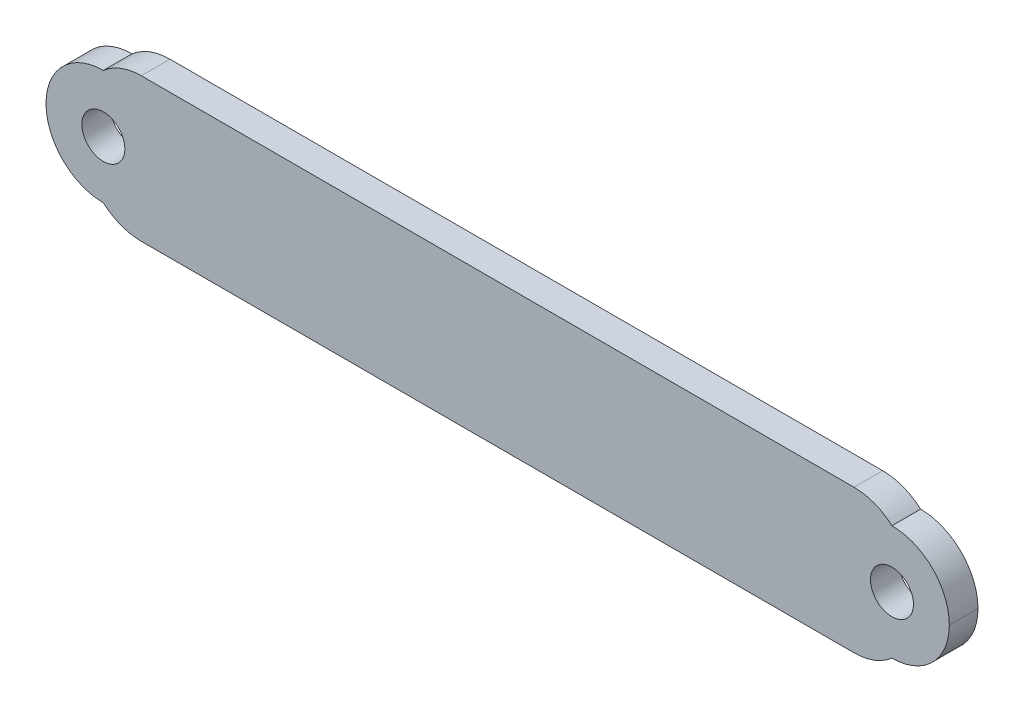
ISO-10303-21;
HEADER;
FILE_DESCRIPTION(('STEP AP214'),'2;1');
FILE_NAME('part.step','',(''),(''),'','','');
FILE_SCHEMA(('AUTOMOTIVE_DESIGN { 1 0 10303 214 1 1 1 1 }'));
ENDSEC;
DATA;
#1=APPLICATION_CONTEXT('core data for automotive mechanical design processes');
#2=APPLICATION_PROTOCOL_DEFINITION('international standard','automotive_design',2000,#1);
#3=PRODUCT_CONTEXT('',#1,'mechanical');
#4=PRODUCT('Part','Part','',(#3));
#5=PRODUCT_RELATED_PRODUCT_CATEGORY('part','',(#4));
#6=PRODUCT_DEFINITION_FORMATION('','',#4);
#7=PRODUCT_DEFINITION_CONTEXT('part definition',#1,'design');
#8=PRODUCT_DEFINITION('design','',#6,#7);
#9=PRODUCT_DEFINITION_SHAPE('','',#8);
#10=(LENGTH_UNIT() NAMED_UNIT(*) SI_UNIT(.MILLI.,.METRE.));
#11=(NAMED_UNIT(*) PLANE_ANGLE_UNIT() SI_UNIT($,.RADIAN.));
#12=(NAMED_UNIT(*) SI_UNIT($,.STERADIAN.) SOLID_ANGLE_UNIT());
#13=UNCERTAINTY_MEASURE_WITH_UNIT(LENGTH_MEASURE(1.E-05),#10,'distance_accuracy_value','');
#14=(GEOMETRIC_REPRESENTATION_CONTEXT(3) GLOBAL_UNCERTAINTY_ASSIGNED_CONTEXT((#13)) GLOBAL_UNIT_ASSIGNED_CONTEXT((#10,
#11,#12)) REPRESENTATION_CONTEXT('',''));
#15=CARTESIAN_POINT('',(0.,0.,0.));
#16=DIRECTION('',(0.,0.,1.));
#17=DIRECTION('',(1.,0.,0.));
#18=AXIS2_PLACEMENT_3D('',#15,#16,#17);
#19=CARTESIAN_POINT('',(0.,0.,2.54));
#20=DIRECTION('',(0.,0.,-1.));
#21=DIRECTION('',(-1.,0.,0.));
#22=AXIS2_PLACEMENT_3D('',#19,#20,#21);
#23=PLANE('',#22);
#24=CARTESIAN_POINT('',(5.08,5.08,2.54));
#25=DIRECTION('',(0.,0.,-1.));
#26=DIRECTION('',(-1.,0.,0.));
#27=AXIS2_PLACEMENT_3D('',#24,#25,#26);
#28=CIRCLE('',#27,5.08);
#29=CARTESIAN_POINT('',(0.,5.08,2.54));
#30=VERTEX_POINT('',#29);
#31=CARTESIAN_POINT('',(5.08,0.,2.54));
#32=VERTEX_POINT('',#31);
#33=EDGE_CURVE('E179',#30,#32,#28,.F.);
#34=ORIENTED_EDGE('',*,*,#33,.T.);
#35=CARTESIAN_POINT('',(8.44010416505203,3.81,2.54));
#36=DIRECTION('',(0.,0.,-1.));
#37=DIRECTION('',(-1.,0.,0.));
#38=AXIS2_PLACEMENT_3D('',#35,#36,#37);
#39=CIRCLE('',#38,5.08);
#40=CARTESIAN_POINT('',(8.44010416505203,-1.27,2.54));
#41=VERTEX_POINT('',#40);
#42=EDGE_CURVE('E46',#32,#41,#39,.F.);
#43=ORIENTED_EDGE('',*,*,#42,.T.);
#44=DIRECTION('',(1.,0.,0.));
#45=VECTOR('',#44,1.);
#46=CARTESIAN_POINT('',(6.34999999999999,-1.27,2.54));
#47=LINE('',#46,#45);
#48=CARTESIAN_POINT('',(71.569895834948,-1.27,2.54));
#49=VERTEX_POINT('',#48);
#50=EDGE_CURVE('E133',#41,#49,#47,.T.);
#51=ORIENTED_EDGE('',*,*,#50,.T.);
#52=CARTESIAN_POINT('',(71.569895834948,3.81,2.54));
#53=DIRECTION('',(0.,0.,1.));
#54=DIRECTION('',(1.,0.,0.));
#55=AXIS2_PLACEMENT_3D('',#52,#53,#54);
#56=CIRCLE('',#55,5.08);
#57=CARTESIAN_POINT('',(74.93,0.,2.54));
#58=VERTEX_POINT('',#57);
#59=EDGE_CURVE('E119',#58,#49,#56,.F.);
#60=ORIENTED_EDGE('',*,*,#59,.F.);
#61=CARTESIAN_POINT('',(74.93,5.08,2.54));
#62=DIRECTION('',(0.,0.,1.));
#63=DIRECTION('',(1.,0.,0.));
#64=AXIS2_PLACEMENT_3D('',#61,#62,#63);
#65=CIRCLE('',#64,5.08);
#66=CARTESIAN_POINT('',(80.01,5.08,2.54));
#67=VERTEX_POINT('',#66);
#68=EDGE_CURVE('E131',#67,#58,#65,.F.);
#69=ORIENTED_EDGE('',*,*,#68,.F.);
#70=CARTESIAN_POINT('',(74.93,5.08,2.54));
#71=DIRECTION('',(0.,0.,1.));
#72=DIRECTION('',(1.,0.,0.));
#73=AXIS2_PLACEMENT_3D('',#70,#71,#72);
#74=CIRCLE('',#73,5.08);
#75=CARTESIAN_POINT('',(74.93,10.16,2.54));
#76=VERTEX_POINT('',#75);
#77=EDGE_CURVE('E140',#76,#67,#74,.F.);
#78=ORIENTED_EDGE('',*,*,#77,.F.);
#79=CARTESIAN_POINT('',(71.569895834948,6.35,2.54));
#80=DIRECTION('',(0.,0.,1.));
#81=DIRECTION('',(1.,0.,0.));
#82=AXIS2_PLACEMENT_3D('',#79,#80,#81);
#83=CIRCLE('',#82,5.08);
#84=CARTESIAN_POINT('',(71.569895834948,11.43,2.54));
#85=VERTEX_POINT('',#84);
#86=EDGE_CURVE('E136',#85,#76,#83,.F.);
#87=ORIENTED_EDGE('',*,*,#86,.F.);
#88=DIRECTION('',(-1.,0.,0.));
#89=VECTOR('',#88,1.);
#90=CARTESIAN_POINT('',(6.35,11.43,2.54));
#91=LINE('',#90,#89);
#92=CARTESIAN_POINT('',(8.44010416505203,11.43,2.54));
#93=VERTEX_POINT('',#92);
#94=EDGE_CURVE('E162',#85,#93,#91,.T.);
#95=ORIENTED_EDGE('',*,*,#94,.T.);
#96=CARTESIAN_POINT('',(8.44010416505203,6.35,2.54));
#97=DIRECTION('',(0.,0.,-1.));
#98=DIRECTION('',(-1.,0.,0.));
#99=AXIS2_PLACEMENT_3D('',#96,#97,#98);
#100=CIRCLE('',#99,5.08);
#101=CARTESIAN_POINT('',(5.08,10.16,2.54));
#102=VERTEX_POINT('',#101);
#103=EDGE_CURVE('E181',#93,#102,#100,.F.);
#104=ORIENTED_EDGE('',*,*,#103,.T.);
#105=CARTESIAN_POINT('',(5.08,5.08,2.54));
#106=DIRECTION('',(0.,0.,-1.));
#107=DIRECTION('',(-1.,0.,0.));
#108=AXIS2_PLACEMENT_3D('',#105,#106,#107);
#109=CIRCLE('',#108,5.08);
#110=EDGE_CURVE('E60',#102,#30,#109,.F.);
#111=ORIENTED_EDGE('',*,*,#110,.T.);
#112=EDGE_LOOP('',(#34,#43,#51,#60,#69,#78,#87,#95,#104,#111));
#113=FACE_BOUND('',#112,.T.);
#114=CARTESIAN_POINT('',(5.08,5.08,2.54));
#115=DIRECTION('',(0.,0.,1.));
#116=DIRECTION('',(1.,0.,0.));
#117=AXIS2_PLACEMENT_3D('',#114,#115,#116);
#118=CIRCLE('',#117,1.905);
#119=CARTESIAN_POINT('',(6.985,5.08,2.54));
#120=VERTEX_POINT('',#119);
#121=EDGE_CURVE('E154',#120,#120,#118,.T.);
#122=ORIENTED_EDGE('',*,*,#121,.F.);
#123=EDGE_LOOP('',(#122));
#124=FACE_BOUND('',#123,.T.);
#125=CARTESIAN_POINT('',(74.93,5.08,2.54));
#126=DIRECTION('',(0.,0.,-1.));
#127=DIRECTION('',(-1.,0.,0.));
#128=AXIS2_PLACEMENT_3D('',#125,#126,#127);
#129=CIRCLE('',#128,1.905);
#130=CARTESIAN_POINT('',(73.025,5.08,2.54));
#131=VERTEX_POINT('',#130);
#132=EDGE_CURVE('E220',#131,#131,#129,.T.);
#133=ORIENTED_EDGE('',*,*,#132,.T.);
#134=EDGE_LOOP('',(#133));
#135=FACE_BOUND('',#134,.T.);
#136=ADVANCED_FACE('F37',(#113,#124,#135),#23,.F.);
#137=CARTESIAN_POINT('',(0.,0.,0.));
#138=DIRECTION('',(0.,0.,-1.));
#139=DIRECTION('',(-1.,0.,0.));
#140=AXIS2_PLACEMENT_3D('',#137,#138,#139);
#141=PLANE('',#140);
#142=DIRECTION('',(1.,0.,0.));
#143=VECTOR('',#142,1.);
#144=CARTESIAN_POINT('',(6.34999999999999,-1.27,0.));
#145=LINE('',#144,#143);
#146=CARTESIAN_POINT('',(8.44010416505203,-1.27,0.));
#147=VERTEX_POINT('',#146);
#148=CARTESIAN_POINT('',(71.569895834948,-1.27,0.));
#149=VERTEX_POINT('',#148);
#150=EDGE_CURVE('E157',#147,#149,#145,.T.);
#151=ORIENTED_EDGE('',*,*,#150,.F.);
#152=CARTESIAN_POINT('',(8.44010416505203,3.81,0.));
#153=DIRECTION('',(0.,0.,-1.));
#154=DIRECTION('',(-1.,0.,0.));
#155=AXIS2_PLACEMENT_3D('',#152,#153,#154);
#156=CIRCLE('',#155,5.08);
#157=CARTESIAN_POINT('',(5.08,0.,0.));
#158=VERTEX_POINT('',#157);
#159=EDGE_CURVE('E176',#147,#158,#156,.T.);
#160=ORIENTED_EDGE('',*,*,#159,.T.);
#161=CARTESIAN_POINT('',(5.08,5.08,0.));
#162=DIRECTION('',(0.,0.,-1.));
#163=DIRECTION('',(-1.,0.,0.));
#164=AXIS2_PLACEMENT_3D('',#161,#162,#163);
#165=CIRCLE('',#164,5.08);
#166=CARTESIAN_POINT('',(0.,5.08,0.));
#167=VERTEX_POINT('',#166);
#168=EDGE_CURVE('E172',#158,#167,#165,.T.);
#169=ORIENTED_EDGE('',*,*,#168,.T.);
#170=CARTESIAN_POINT('',(5.08,5.08,0.));
#171=DIRECTION('',(0.,0.,-1.));
#172=DIRECTION('',(-1.,0.,0.));
#173=AXIS2_PLACEMENT_3D('',#170,#171,#172);
#174=CIRCLE('',#173,5.08);
#175=CARTESIAN_POINT('',(5.08,10.16,0.));
#176=VERTEX_POINT('',#175);
#177=EDGE_CURVE('E170',#167,#176,#174,.T.);
#178=ORIENTED_EDGE('',*,*,#177,.T.);
#179=CARTESIAN_POINT('',(8.44010416505203,6.35,0.));
#180=DIRECTION('',(0.,0.,-1.));
#181=DIRECTION('',(-1.,0.,0.));
#182=AXIS2_PLACEMENT_3D('',#179,#180,#181);
#183=CIRCLE('',#182,5.08);
#184=CARTESIAN_POINT('',(8.44010416505203,11.43,0.));
#185=VERTEX_POINT('',#184);
#186=EDGE_CURVE('E174',#176,#185,#183,.T.);
#187=ORIENTED_EDGE('',*,*,#186,.T.);
#188=DIRECTION('',(-1.,0.,0.));
#189=VECTOR('',#188,1.);
#190=CARTESIAN_POINT('',(6.35,11.43,0.));
#191=LINE('',#190,#189);
#192=CARTESIAN_POINT('',(71.569895834948,11.43,0.));
#193=VERTEX_POINT('',#192);
#194=EDGE_CURVE('E163',#193,#185,#191,.T.);
#195=ORIENTED_EDGE('',*,*,#194,.F.);
#196=CARTESIAN_POINT('',(71.569895834948,6.35,0.));
#197=DIRECTION('',(0.,0.,1.));
#198=DIRECTION('',(1.,0.,0.));
#199=AXIS2_PLACEMENT_3D('',#196,#197,#198);
#200=CIRCLE('',#199,5.08);
#201=CARTESIAN_POINT('',(74.93,10.16,0.));
#202=VERTEX_POINT('',#201);
#203=EDGE_CURVE('E208',#202,#193,#200,.T.);
#204=ORIENTED_EDGE('',*,*,#203,.F.);
#205=CARTESIAN_POINT('',(74.93,5.08,0.));
#206=DIRECTION('',(0.,0.,1.));
#207=DIRECTION('',(1.,0.,0.));
#208=AXIS2_PLACEMENT_3D('',#205,#206,#207);
#209=CIRCLE('',#208,5.08);
#210=CARTESIAN_POINT('',(80.01,5.08,0.));
#211=VERTEX_POINT('',#210);
#212=EDGE_CURVE('E214',#211,#202,#209,.T.);
#213=ORIENTED_EDGE('',*,*,#212,.F.);
#214=CARTESIAN_POINT('',(74.93,5.08,0.));
#215=DIRECTION('',(0.,0.,1.));
#216=DIRECTION('',(1.,0.,0.));
#217=AXIS2_PLACEMENT_3D('',#214,#215,#216);
#218=CIRCLE('',#217,5.08);
#219=CARTESIAN_POINT('',(74.93,0.,0.));
#220=VERTEX_POINT('',#219);
#221=EDGE_CURVE('E212',#220,#211,#218,.T.);
#222=ORIENTED_EDGE('',*,*,#221,.F.);
#223=CARTESIAN_POINT('',(71.569895834948,3.81,0.));
#224=DIRECTION('',(0.,0.,1.));
#225=DIRECTION('',(1.,0.,0.));
#226=AXIS2_PLACEMENT_3D('',#223,#224,#225);
#227=CIRCLE('',#226,5.08);
#228=EDGE_CURVE('E121',#149,#220,#227,.T.);
#229=ORIENTED_EDGE('',*,*,#228,.F.);
#230=EDGE_LOOP('',(#151,#160,#169,#178,#187,#195,#204,#213,#222,#229));
#231=FACE_BOUND('',#230,.T.);
#232=CARTESIAN_POINT('',(5.08,5.08,0.));
#233=DIRECTION('',(0.,0.,1.));
#234=DIRECTION('',(1.,0.,0.));
#235=AXIS2_PLACEMENT_3D('',#232,#233,#234);
#236=CIRCLE('',#235,1.905);
#237=CARTESIAN_POINT('',(6.985,5.08,0.));
#238=VERTEX_POINT('',#237);
#239=EDGE_CURVE('E158',#238,#238,#236,.T.);
#240=ORIENTED_EDGE('',*,*,#239,.T.);
#241=EDGE_LOOP('',(#240));
#242=FACE_BOUND('',#241,.T.);
#243=CARTESIAN_POINT('',(74.93,5.08,0.));
#244=DIRECTION('',(0.,0.,-1.));
#245=DIRECTION('',(-1.,0.,0.));
#246=AXIS2_PLACEMENT_3D('',#243,#244,#245);
#247=CIRCLE('',#246,1.905);
#248=CARTESIAN_POINT('',(73.025,5.08,0.));
#249=VERTEX_POINT('',#248);
#250=EDGE_CURVE('E153',#249,#249,#247,.T.);
#251=ORIENTED_EDGE('',*,*,#250,.F.);
#252=EDGE_LOOP('',(#251));
#253=FACE_BOUND('',#252,.T.);
#254=ADVANCED_FACE('F200',(#231,#242,#253),#141,.T.);
#255=CARTESIAN_POINT('',(6.34999999999999,-1.27,2.54));
#256=DIRECTION('',(0.,1.,0.));
#257=DIRECTION('',(0.,0.,1.));
#258=AXIS2_PLACEMENT_3D('',#255,#256,#257);
#259=PLANE('',#258);
#260=ORIENTED_EDGE('',*,*,#50,.F.);
#261=DIRECTION('',(0.,0.,1.));
#262=VECTOR('',#261,1.);
#263=CARTESIAN_POINT('',(8.44010416505203,-1.27,2.54));
#264=LINE('',#263,#262);
#265=EDGE_CURVE('E165',#41,#147,#264,.F.);
#266=ORIENTED_EDGE('',*,*,#265,.T.);
#267=ORIENTED_EDGE('',*,*,#150,.T.);
#268=DIRECTION('',(0.,0.,1.));
#269=VECTOR('',#268,1.);
#270=CARTESIAN_POINT('',(71.569895834948,-1.27,2.54));
#271=LINE('',#270,#269);
#272=EDGE_CURVE('E218',#49,#149,#271,.F.);
#273=ORIENTED_EDGE('',*,*,#272,.F.);
#274=EDGE_LOOP('',(#260,#266,#267,#273));
#275=FACE_BOUND('',#274,.T.);
#276=ADVANCED_FACE('F235',(#275),#259,.F.);
#277=CARTESIAN_POINT('',(6.35,11.43,2.54));
#278=DIRECTION('',(0.,-1.,0.));
#279=DIRECTION('',(0.,0.,-1.));
#280=AXIS2_PLACEMENT_3D('',#277,#278,#279);
#281=PLANE('',#280);
#282=ORIENTED_EDGE('',*,*,#194,.T.);
#283=DIRECTION('',(0.,0.,-1.));
#284=VECTOR('',#283,1.);
#285=CARTESIAN_POINT('',(8.44010416505203,11.43,2.54));
#286=LINE('',#285,#284);
#287=EDGE_CURVE('E11',#185,#93,#286,.F.);
#288=ORIENTED_EDGE('',*,*,#287,.T.);
#289=ORIENTED_EDGE('',*,*,#94,.F.);
#290=DIRECTION('',(0.,0.,-1.));
#291=VECTOR('',#290,1.);
#292=CARTESIAN_POINT('',(71.569895834948,11.43,2.54));
#293=LINE('',#292,#291);
#294=EDGE_CURVE('E135',#193,#85,#293,.F.);
#295=ORIENTED_EDGE('',*,*,#294,.F.);
#296=EDGE_LOOP('',(#282,#288,#289,#295));
#297=FACE_BOUND('',#296,.T.);
#298=ADVANCED_FACE('F204',(#297),#281,.F.);
#299=CARTESIAN_POINT('',(5.08,5.08,2.54));
#300=DIRECTION('',(0.,0.,-1.));
#301=DIRECTION('',(-1.,0.,0.));
#302=AXIS2_PLACEMENT_3D('',#299,#300,#301);
#303=CYLINDRICAL_SURFACE('',#302,1.905);
#304=ORIENTED_EDGE('',*,*,#121,.T.);
#305=EDGE_LOOP('',(#304));
#306=FACE_BOUND('',#305,.T.);
#307=ORIENTED_EDGE('',*,*,#239,.F.);
#308=EDGE_LOOP('',(#307));
#309=FACE_BOUND('',#308,.T.);
#310=ADVANCED_FACE('F247',(#306,#309),#303,.F.);
#311=CARTESIAN_POINT('',(8.44010416505203,6.35,2.54));
#312=DIRECTION('',(0.,0.,-1.));
#313=DIRECTION('',(-1.,0.,0.));
#314=AXIS2_PLACEMENT_3D('',#311,#312,#313);
#315=CYLINDRICAL_SURFACE('',#314,5.08);
#316=ORIENTED_EDGE('',*,*,#287,.F.);
#317=ORIENTED_EDGE('',*,*,#186,.F.);
#318=DIRECTION('',(0.,0.,-1.));
#319=VECTOR('',#318,1.);
#320=CARTESIAN_POINT('',(5.08,10.16,2.54));
#321=LINE('',#320,#319);
#322=EDGE_CURVE('E41',#102,#176,#321,.T.);
#323=ORIENTED_EDGE('',*,*,#322,.F.);
#324=ORIENTED_EDGE('',*,*,#103,.F.);
#325=EDGE_LOOP('',(#316,#317,#323,#324));
#326=FACE_BOUND('',#325,.T.);
#327=ADVANCED_FACE('F39',(#326),#315,.T.);
#328=CARTESIAN_POINT('',(5.08,5.08,2.54));
#329=DIRECTION('',(0.,0.,-1.));
#330=DIRECTION('',(-1.,0.,0.));
#331=AXIS2_PLACEMENT_3D('',#328,#329,#330);
#332=CYLINDRICAL_SURFACE('',#331,5.08);
#333=ORIENTED_EDGE('',*,*,#322,.T.);
#334=ORIENTED_EDGE('',*,*,#177,.F.);
#335=DIRECTION('',(0.,0.,-1.));
#336=VECTOR('',#335,1.);
#337=CARTESIAN_POINT('',(0.,5.08,2.54));
#338=LINE('',#337,#336);
#339=EDGE_CURVE('E185',#30,#167,#338,.T.);
#340=ORIENTED_EDGE('',*,*,#339,.F.);
#341=ORIENTED_EDGE('',*,*,#110,.F.);
#342=EDGE_LOOP('',(#333,#334,#340,#341));
#343=FACE_BOUND('',#342,.T.);
#344=ADVANCED_FACE('F194',(#343),#332,.T.);
#345=CARTESIAN_POINT('',(5.08,5.08,2.54));
#346=DIRECTION('',(0.,0.,-1.));
#347=DIRECTION('',(-1.,0.,0.));
#348=AXIS2_PLACEMENT_3D('',#345,#346,#347);
#349=CYLINDRICAL_SURFACE('',#348,5.08);
#350=DIRECTION('',(0.,0.,-1.));
#351=VECTOR('',#350,1.);
#352=CARTESIAN_POINT('',(5.08,0.,2.54));
#353=LINE('',#352,#351);
#354=EDGE_CURVE('E148',#32,#158,#353,.T.);
#355=ORIENTED_EDGE('',*,*,#354,.F.);
#356=ORIENTED_EDGE('',*,*,#33,.F.);
#357=ORIENTED_EDGE('',*,*,#339,.T.);
#358=ORIENTED_EDGE('',*,*,#168,.F.);
#359=EDGE_LOOP('',(#355,#356,#357,#358));
#360=FACE_BOUND('',#359,.T.);
#361=ADVANCED_FACE('F251',(#360),#349,.T.);
#362=CARTESIAN_POINT('',(8.44010416505203,3.81,2.54));
#363=DIRECTION('',(0.,0.,1.));
#364=DIRECTION('',(1.,0.,0.));
#365=AXIS2_PLACEMENT_3D('',#362,#363,#364);
#366=CYLINDRICAL_SURFACE('',#365,5.08);
#367=ORIENTED_EDGE('',*,*,#42,.F.);
#368=ORIENTED_EDGE('',*,*,#354,.T.);
#369=ORIENTED_EDGE('',*,*,#159,.F.);
#370=ORIENTED_EDGE('',*,*,#265,.F.);
#371=EDGE_LOOP('',(#367,#368,#369,#370));
#372=FACE_BOUND('',#371,.T.);
#373=ADVANCED_FACE('F230',(#372),#366,.T.);
#374=CARTESIAN_POINT('',(74.93,5.08,2.54));
#375=DIRECTION('',(0.,0.,-1.));
#376=DIRECTION('',(1.,0.,0.));
#377=AXIS2_PLACEMENT_3D('',#374,#375,#376);
#378=CYLINDRICAL_SURFACE('',#377,1.905);
#379=ORIENTED_EDGE('',*,*,#132,.F.);
#380=EDGE_LOOP('',(#379));
#381=FACE_BOUND('',#380,.T.);
#382=ORIENTED_EDGE('',*,*,#250,.T.);
#383=EDGE_LOOP('',(#382));
#384=FACE_BOUND('',#383,.T.);
#385=ADVANCED_FACE('F227',(#381,#384),#378,.F.);
#386=CARTESIAN_POINT('',(71.569895834948,6.35,2.54));
#387=DIRECTION('',(0.,0.,-1.));
#388=DIRECTION('',(1.,0.,0.));
#389=AXIS2_PLACEMENT_3D('',#386,#387,#388);
#390=CYLINDRICAL_SURFACE('',#389,5.08);
#391=ORIENTED_EDGE('',*,*,#294,.T.);
#392=ORIENTED_EDGE('',*,*,#86,.T.);
#393=DIRECTION('',(0.,0.,-1.));
#394=VECTOR('',#393,1.);
#395=CARTESIAN_POINT('',(74.93,10.16,2.54));
#396=LINE('',#395,#394);
#397=EDGE_CURVE('E151',#76,#202,#396,.T.);
#398=ORIENTED_EDGE('',*,*,#397,.T.);
#399=ORIENTED_EDGE('',*,*,#203,.T.);
#400=EDGE_LOOP('',(#391,#392,#398,#399));
#401=FACE_BOUND('',#400,.T.);
#402=ADVANCED_FACE('F209',(#401),#390,.T.);
#403=CARTESIAN_POINT('',(74.93,5.08,2.54));
#404=DIRECTION('',(0.,0.,-1.));
#405=DIRECTION('',(1.,0.,0.));
#406=AXIS2_PLACEMENT_3D('',#403,#404,#405);
#407=CYLINDRICAL_SURFACE('',#406,5.08);
#408=ORIENTED_EDGE('',*,*,#397,.F.);
#409=ORIENTED_EDGE('',*,*,#77,.T.);
#410=DIRECTION('',(0.,0.,-1.));
#411=VECTOR('',#410,1.);
#412=CARTESIAN_POINT('',(80.01,5.08,2.54));
#413=LINE('',#412,#411);
#414=EDGE_CURVE('E126',#67,#211,#413,.T.);
#415=ORIENTED_EDGE('',*,*,#414,.T.);
#416=ORIENTED_EDGE('',*,*,#212,.T.);
#417=EDGE_LOOP('',(#408,#409,#415,#416));
#418=FACE_BOUND('',#417,.T.);
#419=ADVANCED_FACE('F268',(#418),#407,.T.);
#420=CARTESIAN_POINT('',(74.93,5.08,2.54));
#421=DIRECTION('',(0.,0.,-1.));
#422=DIRECTION('',(1.,0.,0.));
#423=AXIS2_PLACEMENT_3D('',#420,#421,#422);
#424=CYLINDRICAL_SURFACE('',#423,5.08);
#425=DIRECTION('',(0.,0.,-1.));
#426=VECTOR('',#425,1.);
#427=CARTESIAN_POINT('',(74.93,0.,2.54));
#428=LINE('',#427,#426);
#429=EDGE_CURVE('E115',#58,#220,#428,.T.);
#430=ORIENTED_EDGE('',*,*,#429,.T.);
#431=ORIENTED_EDGE('',*,*,#221,.T.);
#432=ORIENTED_EDGE('',*,*,#414,.F.);
#433=ORIENTED_EDGE('',*,*,#68,.T.);
#434=EDGE_LOOP('',(#430,#431,#432,#433));
#435=FACE_BOUND('',#434,.T.);
#436=ADVANCED_FACE('F138',(#435),#424,.T.);
#437=CARTESIAN_POINT('',(71.569895834948,3.81,2.54));
#438=DIRECTION('',(0.,0.,1.));
#439=DIRECTION('',(-1.,0.,0.));
#440=AXIS2_PLACEMENT_3D('',#437,#438,#439);
#441=CYLINDRICAL_SURFACE('',#440,5.08);
#442=ORIENTED_EDGE('',*,*,#59,.T.);
#443=ORIENTED_EDGE('',*,*,#272,.T.);
#444=ORIENTED_EDGE('',*,*,#228,.T.);
#445=ORIENTED_EDGE('',*,*,#429,.F.);
#446=EDGE_LOOP('',(#442,#443,#444,#445));
#447=FACE_BOUND('',#446,.T.);
#448=ADVANCED_FACE('F117',(#447),#441,.T.);
#449=CLOSED_SHELL('',(#136,#254,#276,#298,#310,#327,#344,#361,#373,#385,#402,#419,#436,#448));
#450=MANIFOLD_SOLID_BREP('B2',#449);
#451=ADVANCED_BREP_SHAPE_REPRESENTATION('',(#18,#450),#14);
#452=SHAPE_DEFINITION_REPRESENTATION(#9,#451);
ENDSEC;
END-ISO-10303-21;
